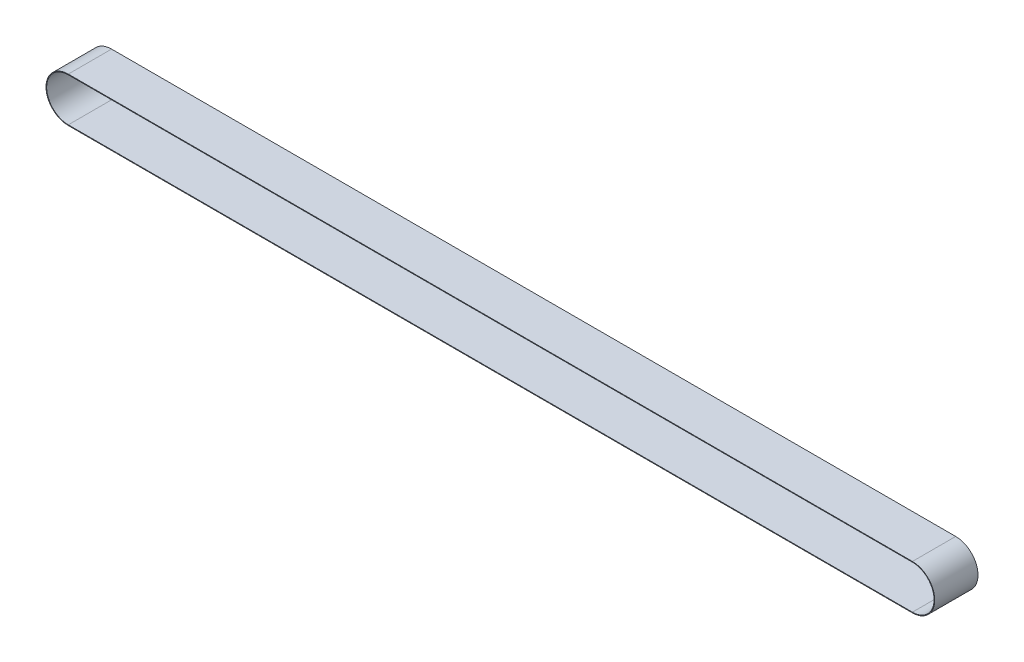
ISO-10303-21;
HEADER;
FILE_DESCRIPTION(('STEP AP214'),'2;1');
FILE_NAME('part.step','',(''),(''),'','','');
FILE_SCHEMA(('AUTOMOTIVE_DESIGN { 1 0 10303 214 1 1 1 1 }'));
ENDSEC;
DATA;
#1=APPLICATION_CONTEXT('core data for automotive mechanical design processes');
#2=APPLICATION_PROTOCOL_DEFINITION('international standard','automotive_design',2000,#1);
#3=PRODUCT_CONTEXT('',#1,'mechanical');
#4=PRODUCT('Part','Part','',(#3));
#5=PRODUCT_RELATED_PRODUCT_CATEGORY('part','',(#4));
#6=PRODUCT_DEFINITION_FORMATION('','',#4);
#7=PRODUCT_DEFINITION_CONTEXT('part definition',#1,'design');
#8=PRODUCT_DEFINITION('design','',#6,#7);
#9=PRODUCT_DEFINITION_SHAPE('','',#8);
#10=(LENGTH_UNIT() NAMED_UNIT(*) SI_UNIT(.MILLI.,.METRE.));
#11=(NAMED_UNIT(*) PLANE_ANGLE_UNIT() SI_UNIT($,.RADIAN.));
#12=(NAMED_UNIT(*) SI_UNIT($,.STERADIAN.) SOLID_ANGLE_UNIT());
#13=UNCERTAINTY_MEASURE_WITH_UNIT(LENGTH_MEASURE(1.E-05),#10,'distance_accuracy_value','');
#14=(GEOMETRIC_REPRESENTATION_CONTEXT(3) GLOBAL_UNCERTAINTY_ASSIGNED_CONTEXT((#13)) GLOBAL_UNIT_ASSIGNED_CONTEXT((#10,
#11,#12)) REPRESENTATION_CONTEXT('',''));
#15=CARTESIAN_POINT('',(0.,0.,0.));
#16=DIRECTION('',(0.,0.,1.));
#17=DIRECTION('',(1.,0.,0.));
#18=AXIS2_PLACEMENT_3D('',#15,#16,#17);
#19=CARTESIAN_POINT('',(8.88178419700125E-13,0.,100.));
#20=DIRECTION('',(0.,0.,-1.));
#21=DIRECTION('',(-1.,0.,0.));
#22=AXIS2_PLACEMENT_3D('',#19,#20,#21);
#23=PLANE('',#22);
#24=CARTESIAN_POINT('',(8.88178419700125E-13,0.,100.));
#25=DIRECTION('',(0.,0.,-1.));
#26=DIRECTION('',(-1.,0.,0.));
#27=AXIS2_PLACEMENT_3D('',#24,#25,#26);
#28=CIRCLE('',#27,103.);
#29=CARTESIAN_POINT('',(8.88178419700125E-13,103.,100.));
#30=VERTEX_POINT('',#29);
#31=CARTESIAN_POINT('',(8.88178419700125E-13,-103.,100.));
#32=VERTEX_POINT('',#31);
#33=EDGE_CURVE('E183',#30,#32,#28,.F.);
#34=ORIENTED_EDGE('',*,*,#33,.T.);
#35=DIRECTION('',(1.,0.,0.));
#36=VECTOR('',#35,1.);
#37=CARTESIAN_POINT('',(8.88178419700125E-13,-103.,100.));
#38=LINE('',#37,#36);
#39=CARTESIAN_POINT('',(3900.,-103.,100.));
#40=VERTEX_POINT('',#39);
#41=EDGE_CURVE('E187',#32,#40,#38,.T.);
#42=ORIENTED_EDGE('',*,*,#41,.T.);
#43=CARTESIAN_POINT('',(3900.,0.,100.));
#44=DIRECTION('',(0.,0.,-1.));
#45=DIRECTION('',(-1.,0.,0.));
#46=AXIS2_PLACEMENT_3D('',#43,#44,#45);
#47=CIRCLE('',#46,103.);
#48=CARTESIAN_POINT('',(3900.,103.,100.));
#49=VERTEX_POINT('',#48);
#50=EDGE_CURVE('E191',#40,#49,#47,.F.);
#51=ORIENTED_EDGE('',*,*,#50,.T.);
#52=DIRECTION('',(-1.,0.,0.));
#53=VECTOR('',#52,1.);
#54=CARTESIAN_POINT('',(8.88178419700125E-13,103.,100.));
#55=LINE('',#54,#53);
#56=EDGE_CURVE('E194',#49,#30,#55,.T.);
#57=ORIENTED_EDGE('',*,*,#56,.T.);
#58=EDGE_LOOP('',(#34,#42,#51,#57));
#59=FACE_BOUND('',#58,.T.);
#60=CARTESIAN_POINT('',(8.88178419700125E-13,0.,100.));
#61=DIRECTION('',(0.,0.,1.));
#62=DIRECTION('',(-1.,0.,0.));
#63=AXIS2_PLACEMENT_3D('',#60,#61,#62);
#64=CIRCLE('',#63,100.);
#65=CARTESIAN_POINT('',(8.88178419700125E-13,100.,100.));
#66=VERTEX_POINT('',#65);
#67=CARTESIAN_POINT('',(8.88178419700125E-13,-100.,100.));
#68=VERTEX_POINT('',#67);
#69=EDGE_CURVE('E135',#66,#68,#64,.T.);
#70=ORIENTED_EDGE('',*,*,#69,.F.);
#71=DIRECTION('',(-1.,0.,0.));
#72=VECTOR('',#71,1.);
#73=CARTESIAN_POINT('',(8.88178419700125E-13,100.,100.));
#74=LINE('',#73,#72);
#75=CARTESIAN_POINT('',(3900.,100.,100.));
#76=VERTEX_POINT('',#75);
#77=EDGE_CURVE('E161',#76,#66,#74,.T.);
#78=ORIENTED_EDGE('',*,*,#77,.F.);
#79=CARTESIAN_POINT('',(3900.,0.,100.));
#80=DIRECTION('',(0.,0.,1.));
#81=DIRECTION('',(-1.,0.,0.));
#82=AXIS2_PLACEMENT_3D('',#79,#80,#81);
#83=CIRCLE('',#82,100.);
#84=CARTESIAN_POINT('',(3900.,-100.,100.));
#85=VERTEX_POINT('',#84);
#86=EDGE_CURVE('E157',#85,#76,#83,.T.);
#87=ORIENTED_EDGE('',*,*,#86,.F.);
#88=DIRECTION('',(1.,0.,0.));
#89=VECTOR('',#88,1.);
#90=CARTESIAN_POINT('',(3900.,-100.,100.));
#91=LINE('',#90,#89);
#92=EDGE_CURVE('E144',#68,#85,#91,.T.);
#93=ORIENTED_EDGE('',*,*,#92,.F.);
#94=EDGE_LOOP('',(#70,#78,#87,#93));
#95=FACE_BOUND('',#94,.T.);
#96=ADVANCED_FACE('F69',(#59,#95),#23,.F.);
#97=CARTESIAN_POINT('',(8.88178419700125E-13,0.,-100.));
#98=DIRECTION('',(0.,0.,-1.));
#99=DIRECTION('',(-1.,0.,0.));
#100=AXIS2_PLACEMENT_3D('',#97,#98,#99);
#101=PLANE('',#100);
#102=CARTESIAN_POINT('',(8.88178419700125E-13,0.,-100.));
#103=DIRECTION('',(0.,0.,-1.));
#104=DIRECTION('',(-1.,0.,0.));
#105=AXIS2_PLACEMENT_3D('',#102,#103,#104);
#106=CIRCLE('',#105,103.);
#107=CARTESIAN_POINT('',(8.88178419700125E-13,103.,-100.));
#108=VERTEX_POINT('',#107);
#109=CARTESIAN_POINT('',(8.88178419700125E-13,-103.,-100.));
#110=VERTEX_POINT('',#109);
#111=EDGE_CURVE('E153',#108,#110,#106,.F.);
#112=ORIENTED_EDGE('',*,*,#111,.F.);
#113=DIRECTION('',(-1.,0.,0.));
#114=VECTOR('',#113,1.);
#115=CARTESIAN_POINT('',(8.88178419700125E-13,103.,-100.));
#116=LINE('',#115,#114);
#117=CARTESIAN_POINT('',(3900.,103.,-100.));
#118=VERTEX_POINT('',#117);
#119=EDGE_CURVE('E188',#118,#108,#116,.T.);
#120=ORIENTED_EDGE('',*,*,#119,.F.);
#121=CARTESIAN_POINT('',(3900.,0.,-100.));
#122=DIRECTION('',(0.,0.,-1.));
#123=DIRECTION('',(-1.,0.,0.));
#124=AXIS2_PLACEMENT_3D('',#121,#122,#123);
#125=CIRCLE('',#124,103.);
#126=CARTESIAN_POINT('',(3900.,-103.,-100.));
#127=VERTEX_POINT('',#126);
#128=EDGE_CURVE('E204',#127,#118,#125,.F.);
#129=ORIENTED_EDGE('',*,*,#128,.F.);
#130=DIRECTION('',(1.,0.,0.));
#131=VECTOR('',#130,1.);
#132=CARTESIAN_POINT('',(8.88178419700125E-13,-103.,-100.));
#133=LINE('',#132,#131);
#134=EDGE_CURVE('E201',#110,#127,#133,.T.);
#135=ORIENTED_EDGE('',*,*,#134,.F.);
#136=EDGE_LOOP('',(#112,#120,#129,#135));
#137=FACE_BOUND('',#136,.T.);
#138=DIRECTION('',(-1.,0.,0.));
#139=VECTOR('',#138,1.);
#140=CARTESIAN_POINT('',(8.88178419700125E-13,100.,-100.));
#141=LINE('',#140,#139);
#142=CARTESIAN_POINT('',(3900.,100.,-100.));
#143=VERTEX_POINT('',#142);
#144=CARTESIAN_POINT('',(8.88178419700125E-13,100.,-100.));
#145=VERTEX_POINT('',#144);
#146=EDGE_CURVE('E145',#143,#145,#141,.T.);
#147=ORIENTED_EDGE('',*,*,#146,.T.);
#148=CARTESIAN_POINT('',(8.88178419700125E-13,0.,-100.));
#149=DIRECTION('',(0.,0.,1.));
#150=DIRECTION('',(-1.,0.,0.));
#151=AXIS2_PLACEMENT_3D('',#148,#149,#150);
#152=CIRCLE('',#151,100.);
#153=CARTESIAN_POINT('',(8.88178419700125E-13,-100.,-100.));
#154=VERTEX_POINT('',#153);
#155=EDGE_CURVE('E93',#145,#154,#152,.T.);
#156=ORIENTED_EDGE('',*,*,#155,.T.);
#157=DIRECTION('',(1.,0.,0.));
#158=VECTOR('',#157,1.);
#159=CARTESIAN_POINT('',(3900.,-100.,-100.));
#160=LINE('',#159,#158);
#161=CARTESIAN_POINT('',(3900.,-100.,-100.));
#162=VERTEX_POINT('',#161);
#163=EDGE_CURVE('E151',#154,#162,#160,.T.);
#164=ORIENTED_EDGE('',*,*,#163,.T.);
#165=CARTESIAN_POINT('',(3900.,0.,-100.));
#166=DIRECTION('',(0.,0.,1.));
#167=DIRECTION('',(-1.,0.,0.));
#168=AXIS2_PLACEMENT_3D('',#165,#166,#167);
#169=CIRCLE('',#168,100.);
#170=EDGE_CURVE('E170',#162,#143,#169,.T.);
#171=ORIENTED_EDGE('',*,*,#170,.T.);
#172=EDGE_LOOP('',(#147,#156,#164,#171));
#173=FACE_BOUND('',#172,.T.);
#174=ADVANCED_FACE('F227',(#137,#173),#101,.T.);
#175=CARTESIAN_POINT('',(8.88178419700125E-13,0.,100.));
#176=DIRECTION('',(0.,0.,-1.));
#177=DIRECTION('',(-1.,0.,0.));
#178=AXIS2_PLACEMENT_3D('',#175,#176,#177);
#179=CYLINDRICAL_SURFACE('',#178,103.);
#180=ORIENTED_EDGE('',*,*,#111,.T.);
#181=DIRECTION('',(0.,0.,-1.));
#182=VECTOR('',#181,1.);
#183=CARTESIAN_POINT('',(8.88178419700125E-13,-103.,100.));
#184=LINE('',#183,#182);
#185=EDGE_CURVE('E12',#32,#110,#184,.T.);
#186=ORIENTED_EDGE('',*,*,#185,.F.);
#187=ORIENTED_EDGE('',*,*,#33,.F.);
#188=DIRECTION('',(0.,0.,-1.));
#189=VECTOR('',#188,1.);
#190=CARTESIAN_POINT('',(8.88178419700125E-13,103.,100.));
#191=LINE('',#190,#189);
#192=EDGE_CURVE('E197',#30,#108,#191,.T.);
#193=ORIENTED_EDGE('',*,*,#192,.T.);
#194=EDGE_LOOP('',(#180,#186,#187,#193));
#195=FACE_BOUND('',#194,.T.);
#196=ADVANCED_FACE('F71',(#195),#179,.T.);
#197=CARTESIAN_POINT('',(8.88178419700125E-13,-103.,100.));
#198=DIRECTION('',(0.,1.,0.));
#199=DIRECTION('',(0.,0.,1.));
#200=AXIS2_PLACEMENT_3D('',#197,#198,#199);
#201=PLANE('',#200);
#202=ORIENTED_EDGE('',*,*,#134,.T.);
#203=DIRECTION('',(0.,0.,-1.));
#204=VECTOR('',#203,1.);
#205=CARTESIAN_POINT('',(3900.,-103.,100.));
#206=LINE('',#205,#204);
#207=EDGE_CURVE('E78',#40,#127,#206,.T.);
#208=ORIENTED_EDGE('',*,*,#207,.F.);
#209=ORIENTED_EDGE('',*,*,#41,.F.);
#210=ORIENTED_EDGE('',*,*,#185,.T.);
#211=EDGE_LOOP('',(#202,#208,#209,#210));
#212=FACE_BOUND('',#211,.T.);
#213=ADVANCED_FACE('F237',(#212),#201,.F.);
#214=CARTESIAN_POINT('',(3900.,0.,100.));
#215=DIRECTION('',(0.,0.,-1.));
#216=DIRECTION('',(-1.,0.,0.));
#217=AXIS2_PLACEMENT_3D('',#214,#215,#216);
#218=CYLINDRICAL_SURFACE('',#217,103.);
#219=ORIENTED_EDGE('',*,*,#128,.T.);
#220=DIRECTION('',(0.,0.,-1.));
#221=VECTOR('',#220,1.);
#222=CARTESIAN_POINT('',(3900.,103.,100.));
#223=LINE('',#222,#221);
#224=EDGE_CURVE('E212',#49,#118,#223,.T.);
#225=ORIENTED_EDGE('',*,*,#224,.F.);
#226=ORIENTED_EDGE('',*,*,#50,.F.);
#227=ORIENTED_EDGE('',*,*,#207,.T.);
#228=EDGE_LOOP('',(#219,#225,#226,#227));
#229=FACE_BOUND('',#228,.T.);
#230=ADVANCED_FACE('F221',(#229),#218,.T.);
#231=CARTESIAN_POINT('',(8.88178419700125E-13,103.,100.));
#232=DIRECTION('',(0.,-1.,0.));
#233=DIRECTION('',(0.,0.,-1.));
#234=AXIS2_PLACEMENT_3D('',#231,#232,#233);
#235=PLANE('',#234);
#236=ORIENTED_EDGE('',*,*,#119,.T.);
#237=ORIENTED_EDGE('',*,*,#192,.F.);
#238=ORIENTED_EDGE('',*,*,#56,.F.);
#239=ORIENTED_EDGE('',*,*,#224,.T.);
#240=EDGE_LOOP('',(#236,#237,#238,#239));
#241=FACE_BOUND('',#240,.T.);
#242=ADVANCED_FACE('F231',(#241),#235,.F.);
#243=CARTESIAN_POINT('',(8.88178419700125E-13,0.,100.));
#244=DIRECTION('',(0.,0.,-1.));
#245=DIRECTION('',(-1.,0.,0.));
#246=AXIS2_PLACEMENT_3D('',#243,#244,#245);
#247=CYLINDRICAL_SURFACE('',#246,100.);
#248=ORIENTED_EDGE('',*,*,#155,.F.);
#249=DIRECTION('',(0.,0.,-1.));
#250=VECTOR('',#249,1.);
#251=CARTESIAN_POINT('',(8.88178419700125E-13,100.,100.));
#252=LINE('',#251,#250);
#253=EDGE_CURVE('E139',#66,#145,#252,.T.);
#254=ORIENTED_EDGE('',*,*,#253,.F.);
#255=ORIENTED_EDGE('',*,*,#69,.T.);
#256=DIRECTION('',(0.,0.,-1.));
#257=VECTOR('',#256,1.);
#258=CARTESIAN_POINT('',(8.88178419700125E-13,-100.,100.));
#259=LINE('',#258,#257);
#260=EDGE_CURVE('E138',#68,#154,#259,.T.);
#261=ORIENTED_EDGE('',*,*,#260,.T.);
#262=EDGE_LOOP('',(#248,#254,#255,#261));
#263=FACE_BOUND('',#262,.T.);
#264=ADVANCED_FACE('F137',(#263),#247,.F.);
#265=CARTESIAN_POINT('',(3900.,-100.,100.));
#266=DIRECTION('',(0.,1.,0.));
#267=DIRECTION('',(0.,0.,1.));
#268=AXIS2_PLACEMENT_3D('',#265,#266,#267);
#269=PLANE('',#268);
#270=ORIENTED_EDGE('',*,*,#163,.F.);
#271=ORIENTED_EDGE('',*,*,#260,.F.);
#272=ORIENTED_EDGE('',*,*,#92,.T.);
#273=DIRECTION('',(0.,0.,-1.));
#274=VECTOR('',#273,1.);
#275=CARTESIAN_POINT('',(3900.,-100.,100.));
#276=LINE('',#275,#274);
#277=EDGE_CURVE('E154',#85,#162,#276,.T.);
#278=ORIENTED_EDGE('',*,*,#277,.T.);
#279=EDGE_LOOP('',(#270,#271,#272,#278));
#280=FACE_BOUND('',#279,.T.);
#281=ADVANCED_FACE('F148',(#280),#269,.T.);
#282=CARTESIAN_POINT('',(3900.,0.,100.));
#283=DIRECTION('',(0.,0.,-1.));
#284=DIRECTION('',(-1.,0.,0.));
#285=AXIS2_PLACEMENT_3D('',#282,#283,#284);
#286=CYLINDRICAL_SURFACE('',#285,100.);
#287=ORIENTED_EDGE('',*,*,#170,.F.);
#288=ORIENTED_EDGE('',*,*,#277,.F.);
#289=ORIENTED_EDGE('',*,*,#86,.T.);
#290=DIRECTION('',(0.,0.,-1.));
#291=VECTOR('',#290,1.);
#292=CARTESIAN_POINT('',(3900.,100.,100.));
#293=LINE('',#292,#291);
#294=EDGE_CURVE('E85',#76,#143,#293,.T.);
#295=ORIENTED_EDGE('',*,*,#294,.T.);
#296=EDGE_LOOP('',(#287,#288,#289,#295));
#297=FACE_BOUND('',#296,.T.);
#298=ADVANCED_FACE('F260',(#297),#286,.F.);
#299=CARTESIAN_POINT('',(8.88178419700125E-13,100.,100.));
#300=DIRECTION('',(0.,-1.,0.));
#301=DIRECTION('',(0.,0.,-1.));
#302=AXIS2_PLACEMENT_3D('',#299,#300,#301);
#303=PLANE('',#302);
#304=ORIENTED_EDGE('',*,*,#146,.F.);
#305=ORIENTED_EDGE('',*,*,#294,.F.);
#306=ORIENTED_EDGE('',*,*,#77,.T.);
#307=ORIENTED_EDGE('',*,*,#253,.T.);
#308=EDGE_LOOP('',(#304,#305,#306,#307));
#309=FACE_BOUND('',#308,.T.);
#310=ADVANCED_FACE('F264',(#309),#303,.T.);
#311=CLOSED_SHELL('',(#96,#174,#196,#213,#230,#242,#264,#281,#298,#310));
#312=MANIFOLD_SOLID_BREP('B2',#311);
#313=ADVANCED_BREP_SHAPE_REPRESENTATION('',(#18,#312),#14);
#314=SHAPE_DEFINITION_REPRESENTATION(#9,#313);
ENDSEC;
END-ISO-10303-21;
